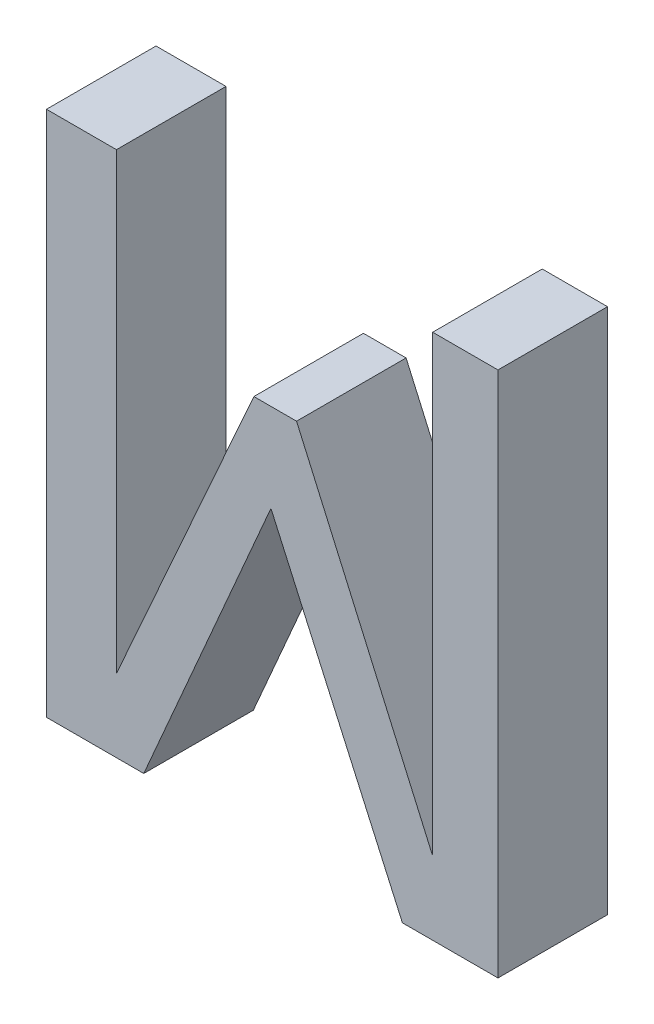
ISO-10303-21;
HEADER;
FILE_DESCRIPTION(('STEP AP214'),'2;1');
FILE_NAME('part.step','',(''),(''),'','','');
FILE_SCHEMA(('AUTOMOTIVE_DESIGN { 1 0 10303 214 1 1 1 1 }'));
ENDSEC;
DATA;
#1=APPLICATION_CONTEXT('core data for automotive mechanical design processes');
#2=APPLICATION_PROTOCOL_DEFINITION('international standard','automotive_design',2000,#1);
#3=PRODUCT_CONTEXT('',#1,'mechanical');
#4=PRODUCT('Part','Part','',(#3));
#5=PRODUCT_RELATED_PRODUCT_CATEGORY('part','',(#4));
#6=PRODUCT_DEFINITION_FORMATION('','',#4);
#7=PRODUCT_DEFINITION_CONTEXT('part definition',#1,'design');
#8=PRODUCT_DEFINITION('design','',#6,#7);
#9=PRODUCT_DEFINITION_SHAPE('','',#8);
#10=(LENGTH_UNIT() NAMED_UNIT(*) SI_UNIT(.MILLI.,.METRE.));
#11=(NAMED_UNIT(*) PLANE_ANGLE_UNIT() SI_UNIT($,.RADIAN.));
#12=(NAMED_UNIT(*) SI_UNIT($,.STERADIAN.) SOLID_ANGLE_UNIT());
#13=UNCERTAINTY_MEASURE_WITH_UNIT(LENGTH_MEASURE(1.E-05),#10,'distance_accuracy_value','');
#14=(GEOMETRIC_REPRESENTATION_CONTEXT(3) GLOBAL_UNCERTAINTY_ASSIGNED_CONTEXT((#13)) GLOBAL_UNIT_ASSIGNED_CONTEXT((#10,
#11,#12)) REPRESENTATION_CONTEXT('',''));
#15=CARTESIAN_POINT('',(0.,0.,0.));
#16=DIRECTION('',(0.,0.,1.));
#17=DIRECTION('',(1.,0.,0.));
#18=AXIS2_PLACEMENT_3D('',#15,#16,#17);
#19=CARTESIAN_POINT('',(-6.378337835046,-7.921012287779,0.));
#20=DIRECTION('',(1.,0.,0.));
#21=DIRECTION('',(0.,1.,0.));
#22=AXIS2_PLACEMENT_3D('',#19,#20,#21);
#23=PLANE('',#22);
#24=DIRECTION('',(0.,-1.,0.));
#25=VECTOR('',#24,1.);
#26=CARTESIAN_POINT('',(-6.378337835046,-7.506899475119,0.));
#27=LINE('',#26,#25);
#28=CARTESIAN_POINT('',(-6.378337835046,-7.506899475119,0.));
#29=VERTEX_POINT('',#28);
#30=CARTESIAN_POINT('',(-6.378337835046,-7.921012287779,0.));
#31=VERTEX_POINT('',#30);
#32=EDGE_CURVE('E11',#29,#31,#27,.T.);
#33=ORIENTED_EDGE('',*,*,#32,.F.);
#34=DIRECTION('',(0.,0.,1.));
#35=VECTOR('',#34,1.);
#36=CARTESIAN_POINT('',(-6.378337835046,-7.506899475119,0.));
#37=LINE('',#36,#35);
#38=CARTESIAN_POINT('',(-6.378337835046,-7.506899475119,0.1));
#39=VERTEX_POINT('',#38);
#40=EDGE_CURVE('E24',#29,#39,#37,.T.);
#41=ORIENTED_EDGE('',*,*,#40,.T.);
#42=DIRECTION('',(0.,1.,0.));
#43=VECTOR('',#42,1.);
#44=CARTESIAN_POINT('',(-6.378337835046,-7.506899475119,0.1));
#45=LINE('',#44,#43);
#46=CARTESIAN_POINT('',(-6.378337835046,-7.921012287779,0.1));
#47=VERTEX_POINT('',#46);
#48=EDGE_CURVE('E130',#47,#39,#45,.T.);
#49=ORIENTED_EDGE('',*,*,#48,.F.);
#50=DIRECTION('',(0.,0.,1.));
#51=VECTOR('',#50,1.);
#52=CARTESIAN_POINT('',(-6.378337835046,-7.921012287779,0.));
#53=LINE('',#52,#51);
#54=EDGE_CURVE('E211',#31,#47,#53,.T.);
#55=ORIENTED_EDGE('',*,*,#54,.F.);
#56=EDGE_LOOP('',(#33,#41,#49,#55));
#57=FACE_BOUND('',#56,.T.);
#58=ADVANCED_FACE('F17',(#57),#23,.T.);
#59=CARTESIAN_POINT('',(-6.252896324532,-7.639353243985,0.));
#60=DIRECTION('',(-0.913498663408962,0.406841728378542,0.));
#61=DIRECTION('',(-0.406841728378542,-0.913498663408962,0.));
#62=AXIS2_PLACEMENT_3D('',#59,#60,#61);
#63=PLANE('',#62);
#64=DIRECTION('',(0.406841728378542,0.913498663408962,0.));
#65=VECTOR('',#64,1.);
#66=CARTESIAN_POINT('',(-6.378337835046,-7.921012287779,0.));
#67=LINE('',#66,#65);
#68=CARTESIAN_POINT('',(-6.252896324532,-7.639353243985,0.));
#69=VERTEX_POINT('',#68);
#70=EDGE_CURVE('E209',#31,#69,#67,.T.);
#71=ORIENTED_EDGE('',*,*,#70,.F.);
#72=ORIENTED_EDGE('',*,*,#54,.T.);
#73=DIRECTION('',(-0.406841728378542,-0.913498663408962,0.));
#74=VECTOR('',#73,1.);
#75=CARTESIAN_POINT('',(-6.378337835046,-7.921012287779,0.1));
#76=LINE('',#75,#74);
#77=CARTESIAN_POINT('',(-6.252896324532,-7.639353243985,0.1));
#78=VERTEX_POINT('',#77);
#79=EDGE_CURVE('E207',#78,#47,#76,.T.);
#80=ORIENTED_EDGE('',*,*,#79,.F.);
#81=DIRECTION('',(0.,0.,1.));
#82=VECTOR('',#81,1.);
#83=CARTESIAN_POINT('',(-6.252896324532,-7.639353243985,0.));
#84=LINE('',#83,#82);
#85=EDGE_CURVE('E204',#69,#78,#84,.T.);
#86=ORIENTED_EDGE('',*,*,#85,.F.);
#87=EDGE_LOOP('',(#71,#72,#80,#86));
#88=FACE_BOUND('',#87,.T.);
#89=ADVANCED_FACE('F253',(#88),#63,.T.);
#90=CARTESIAN_POINT('',(-6.213939333689,-7.639353243985,0.));
#91=DIRECTION('',(0.,1.,0.));
#92=DIRECTION('',(-1.,0.,0.));
#93=AXIS2_PLACEMENT_3D('',#90,#91,#92);
#94=PLANE('',#93);
#95=DIRECTION('',(1.,0.,0.));
#96=VECTOR('',#95,1.);
#97=CARTESIAN_POINT('',(-6.252896324532,-7.639353243985,0.));
#98=LINE('',#97,#96);
#99=CARTESIAN_POINT('',(-6.213939333689,-7.639353243985,0.));
#100=VERTEX_POINT('',#99);
#101=EDGE_CURVE('E202',#69,#100,#98,.T.);
#102=ORIENTED_EDGE('',*,*,#101,.F.);
#103=ORIENTED_EDGE('',*,*,#85,.T.);
#104=DIRECTION('',(-1.,0.,0.));
#105=VECTOR('',#104,1.);
#106=CARTESIAN_POINT('',(-6.252896324532,-7.639353243985,0.1));
#107=LINE('',#106,#105);
#108=CARTESIAN_POINT('',(-6.213939333689,-7.639353243985,0.1));
#109=VERTEX_POINT('',#108);
#110=EDGE_CURVE('E199',#109,#78,#107,.T.);
#111=ORIENTED_EDGE('',*,*,#110,.F.);
#112=DIRECTION('',(0.,0.,1.));
#113=VECTOR('',#112,1.);
#114=CARTESIAN_POINT('',(-6.213939333689,-7.639353243985,0.));
#115=LINE('',#114,#113);
#116=EDGE_CURVE('E196',#100,#109,#115,.T.);
#117=ORIENTED_EDGE('',*,*,#116,.F.);
#118=EDGE_LOOP('',(#102,#103,#111,#117));
#119=FACE_BOUND('',#118,.T.);
#120=ADVANCED_FACE('F249',(#119),#94,.T.);
#121=CARTESIAN_POINT('',(-6.0896665329,-7.921012287779,0.));
#122=DIRECTION('',(0.914904056356068,0.403671360964848,0.));
#123=DIRECTION('',(-0.403671360964848,0.914904056356068,0.));
#124=AXIS2_PLACEMENT_3D('',#121,#122,#123);
#125=PLANE('',#124);
#126=DIRECTION('',(0.403671360964848,-0.914904056356068,0.));
#127=VECTOR('',#126,1.);
#128=CARTESIAN_POINT('',(-6.213939333689,-7.639353243985,0.));
#129=LINE('',#128,#127);
#130=CARTESIAN_POINT('',(-6.0896665329,-7.921012287779,0.));
#131=VERTEX_POINT('',#130);
#132=EDGE_CURVE('E194',#100,#131,#129,.T.);
#133=ORIENTED_EDGE('',*,*,#132,.F.);
#134=ORIENTED_EDGE('',*,*,#116,.T.);
#135=DIRECTION('',(-0.403671360964848,0.914904056356068,0.));
#136=VECTOR('',#135,1.);
#137=CARTESIAN_POINT('',(-6.213939333689,-7.639353243985,0.1));
#138=LINE('',#137,#136);
#139=CARTESIAN_POINT('',(-6.0896665329,-7.921012287779,0.1));
#140=VERTEX_POINT('',#139);
#141=EDGE_CURVE('E191',#140,#109,#138,.T.);
#142=ORIENTED_EDGE('',*,*,#141,.F.);
#143=DIRECTION('',(0.,0.,1.));
#144=VECTOR('',#143,1.);
#145=CARTESIAN_POINT('',(-6.0896665329,-7.921012287779,0.));
#146=LINE('',#145,#144);
#147=EDGE_CURVE('E188',#131,#140,#146,.T.);
#148=ORIENTED_EDGE('',*,*,#147,.F.);
#149=EDGE_LOOP('',(#133,#134,#142,#148));
#150=FACE_BOUND('',#149,.T.);
#151=ADVANCED_FACE('F245',(#150),#125,.T.);
#152=CARTESIAN_POINT('',(-6.0896665329,-7.506899475119,0.));
#153=DIRECTION('',(-1.,0.,0.));
#154=DIRECTION('',(0.,-1.,0.));
#155=AXIS2_PLACEMENT_3D('',#152,#153,#154);
#156=PLANE('',#155);
#157=DIRECTION('',(0.,1.,0.));
#158=VECTOR('',#157,1.);
#159=CARTESIAN_POINT('',(-6.0896665329,-7.921012287779,0.));
#160=LINE('',#159,#158);
#161=CARTESIAN_POINT('',(-6.0896665329,-7.506899475119,0.));
#162=VERTEX_POINT('',#161);
#163=EDGE_CURVE('E186',#131,#162,#160,.T.);
#164=ORIENTED_EDGE('',*,*,#163,.F.);
#165=ORIENTED_EDGE('',*,*,#147,.T.);
#166=DIRECTION('',(0.,-1.,0.));
#167=VECTOR('',#166,1.);
#168=CARTESIAN_POINT('',(-6.0896665329,-7.921012287779,0.1));
#169=LINE('',#168,#167);
#170=CARTESIAN_POINT('',(-6.0896665329,-7.506899475119,0.1));
#171=VERTEX_POINT('',#170);
#172=EDGE_CURVE('E183',#171,#140,#169,.T.);
#173=ORIENTED_EDGE('',*,*,#172,.F.);
#174=DIRECTION('',(0.,0.,1.));
#175=VECTOR('',#174,1.);
#176=CARTESIAN_POINT('',(-6.0896665329,-7.506899475119,0.));
#177=LINE('',#176,#175);
#178=EDGE_CURVE('E180',#162,#171,#177,.T.);
#179=ORIENTED_EDGE('',*,*,#178,.F.);
#180=EDGE_LOOP('',(#164,#165,#173,#179));
#181=FACE_BOUND('',#180,.T.);
#182=ADVANCED_FACE('F241',(#181),#156,.T.);
#183=CARTESIAN_POINT('',(-6.030062336911,-7.506899475119,0.));
#184=DIRECTION('',(0.,1.,0.));
#185=DIRECTION('',(-1.,0.,0.));
#186=AXIS2_PLACEMENT_3D('',#183,#184,#185);
#187=PLANE('',#186);
#188=DIRECTION('',(1.,0.,0.));
#189=VECTOR('',#188,1.);
#190=CARTESIAN_POINT('',(-6.0896665329,-7.506899475119,0.));
#191=LINE('',#190,#189);
#192=CARTESIAN_POINT('',(-6.030062336911,-7.506899475119,0.));
#193=VERTEX_POINT('',#192);
#194=EDGE_CURVE('E178',#162,#193,#191,.T.);
#195=ORIENTED_EDGE('',*,*,#194,.F.);
#196=ORIENTED_EDGE('',*,*,#178,.T.);
#197=DIRECTION('',(-1.,0.,0.));
#198=VECTOR('',#197,1.);
#199=CARTESIAN_POINT('',(-6.0896665329,-7.506899475119,0.1));
#200=LINE('',#199,#198);
#201=CARTESIAN_POINT('',(-6.030062336911,-7.506899475119,0.1));
#202=VERTEX_POINT('',#201);
#203=EDGE_CURVE('E175',#202,#171,#200,.T.);
#204=ORIENTED_EDGE('',*,*,#203,.F.);
#205=DIRECTION('',(0.,0.,1.));
#206=VECTOR('',#205,1.);
#207=CARTESIAN_POINT('',(-6.030062336911,-7.506899475119,0.));
#208=LINE('',#207,#206);
#209=EDGE_CURVE('E172',#193,#202,#208,.T.);
#210=ORIENTED_EDGE('',*,*,#209,.F.);
#211=EDGE_LOOP('',(#195,#196,#204,#210));
#212=FACE_BOUND('',#211,.T.);
#213=ADVANCED_FACE('F237',(#212),#187,.T.);
#214=CARTESIAN_POINT('',(-6.030062336911,-7.98762874212,0.));
#215=DIRECTION('',(1.,0.,0.));
#216=DIRECTION('',(0.,1.,0.));
#217=AXIS2_PLACEMENT_3D('',#214,#215,#216);
#218=PLANE('',#217);
#219=DIRECTION('',(0.,-1.,0.));
#220=VECTOR('',#219,1.);
#221=CARTESIAN_POINT('',(-6.030062336911,-7.506899475119,0.));
#222=LINE('',#221,#220);
#223=CARTESIAN_POINT('',(-6.030062336911,-7.98762874212,0.));
#224=VERTEX_POINT('',#223);
#225=EDGE_CURVE('E170',#193,#224,#222,.T.);
#226=ORIENTED_EDGE('',*,*,#225,.F.);
#227=ORIENTED_EDGE('',*,*,#209,.T.);
#228=DIRECTION('',(0.,1.,0.));
#229=VECTOR('',#228,1.);
#230=CARTESIAN_POINT('',(-6.030062336911,-7.506899475119,0.1));
#231=LINE('',#230,#229);
#232=CARTESIAN_POINT('',(-6.030062336911,-7.98762874212,0.1));
#233=VERTEX_POINT('',#232);
#234=EDGE_CURVE('E167',#233,#202,#231,.T.);
#235=ORIENTED_EDGE('',*,*,#234,.F.);
#236=DIRECTION('',(0.,0.,1.));
#237=VECTOR('',#236,1.);
#238=CARTESIAN_POINT('',(-6.030062336911,-7.98762874212,0.));
#239=LINE('',#238,#237);
#240=EDGE_CURVE('E164',#224,#233,#239,.T.);
#241=ORIENTED_EDGE('',*,*,#240,.F.);
#242=EDGE_LOOP('',(#226,#227,#235,#241));
#243=FACE_BOUND('',#242,.T.);
#244=ADVANCED_FACE('F233',(#243),#218,.T.);
#245=CARTESIAN_POINT('',(-6.117325996399,-7.98762874212,0.));
#246=DIRECTION('',(0.,-1.,0.));
#247=DIRECTION('',(1.,0.,0.));
#248=AXIS2_PLACEMENT_3D('',#245,#246,#247);
#249=PLANE('',#248);
#250=DIRECTION('',(-1.,0.,0.));
#251=VECTOR('',#250,1.);
#252=CARTESIAN_POINT('',(-6.030062336911,-7.98762874212,0.));
#253=LINE('',#252,#251);
#254=CARTESIAN_POINT('',(-6.117325996399,-7.98762874212,0.));
#255=VERTEX_POINT('',#254);
#256=EDGE_CURVE('E162',#224,#255,#253,.T.);
#257=ORIENTED_EDGE('',*,*,#256,.F.);
#258=ORIENTED_EDGE('',*,*,#240,.T.);
#259=DIRECTION('',(1.,0.,0.));
#260=VECTOR('',#259,1.);
#261=CARTESIAN_POINT('',(-6.030062336911,-7.98762874212,0.1));
#262=LINE('',#261,#260);
#263=CARTESIAN_POINT('',(-6.117325996399,-7.98762874212,0.1));
#264=VERTEX_POINT('',#263);
#265=EDGE_CURVE('E159',#264,#233,#262,.T.);
#266=ORIENTED_EDGE('',*,*,#265,.F.);
#267=DIRECTION('',(0.,0.,1.));
#268=VECTOR('',#267,1.);
#269=CARTESIAN_POINT('',(-6.117325996399,-7.98762874212,0.));
#270=LINE('',#269,#268);
#271=EDGE_CURVE('E156',#255,#264,#270,.T.);
#272=ORIENTED_EDGE('',*,*,#271,.F.);
#273=EDGE_LOOP('',(#257,#258,#266,#272));
#274=FACE_BOUND('',#273,.T.);
#275=ADVANCED_FACE('F229',(#274),#249,.T.);
#276=CARTESIAN_POINT('',(-6.237313528195,-7.71999421503,0.));
#277=DIRECTION('',(-0.912492227721691,-0.409094040958195,0.));
#278=DIRECTION('',(0.409094040958195,-0.912492227721691,0.));
#279=AXIS2_PLACEMENT_3D('',#276,#277,#278);
#280=PLANE('',#279);
#281=DIRECTION('',(-0.409094040958195,0.912492227721691,0.));
#282=VECTOR('',#281,1.);
#283=CARTESIAN_POINT('',(-6.117325996399,-7.98762874212,0.));
#284=LINE('',#283,#282);
#285=CARTESIAN_POINT('',(-6.237313528195,-7.71999421503,0.));
#286=VERTEX_POINT('',#285);
#287=EDGE_CURVE('E154',#255,#286,#284,.T.);
#288=ORIENTED_EDGE('',*,*,#287,.F.);
#289=ORIENTED_EDGE('',*,*,#271,.T.);
#290=DIRECTION('',(0.409094040958195,-0.912492227721691,0.));
#291=VECTOR('',#290,1.);
#292=CARTESIAN_POINT('',(-6.117325996399,-7.98762874212,0.1));
#293=LINE('',#292,#291);
#294=CARTESIAN_POINT('',(-6.237313528195,-7.71999421503,0.1));
#295=VERTEX_POINT('',#294);
#296=EDGE_CURVE('E151',#295,#264,#293,.T.);
#297=ORIENTED_EDGE('',*,*,#296,.F.);
#298=DIRECTION('',(0.,0.,1.));
#299=VECTOR('',#298,1.);
#300=CARTESIAN_POINT('',(-6.237313528195,-7.71999421503,0.));
#301=LINE('',#300,#299);
#302=EDGE_CURVE('E148',#286,#295,#301,.T.);
#303=ORIENTED_EDGE('',*,*,#302,.F.);
#304=EDGE_LOOP('',(#288,#289,#297,#303));
#305=FACE_BOUND('',#304,.T.);
#306=ADVANCED_FACE('F225',(#305),#280,.T.);
#307=CARTESIAN_POINT('',(-6.353405360906,-7.98762874212,0.));
#308=DIRECTION('',(0.917409408006231,-0.397944692264712,0.));
#309=DIRECTION('',(0.397944692264712,0.917409408006231,0.));
#310=AXIS2_PLACEMENT_3D('',#307,#308,#309);
#311=PLANE('',#310);
#312=DIRECTION('',(-0.397944692264712,-0.917409408006231,0.));
#313=VECTOR('',#312,1.);
#314=CARTESIAN_POINT('',(-6.237313528195,-7.71999421503,0.));
#315=LINE('',#314,#313);
#316=CARTESIAN_POINT('',(-6.353405360906,-7.98762874212,0.));
#317=VERTEX_POINT('',#316);
#318=EDGE_CURVE('E146',#286,#317,#315,.T.);
#319=ORIENTED_EDGE('',*,*,#318,.F.);
#320=ORIENTED_EDGE('',*,*,#302,.T.);
#321=DIRECTION('',(0.397944692264712,0.917409408006231,0.));
#322=VECTOR('',#321,1.);
#323=CARTESIAN_POINT('',(-6.237313528195,-7.71999421503,0.1));
#324=LINE('',#323,#322);
#325=CARTESIAN_POINT('',(-6.353405360906,-7.98762874212,0.1));
#326=VERTEX_POINT('',#325);
#327=EDGE_CURVE('E143',#326,#295,#324,.T.);
#328=ORIENTED_EDGE('',*,*,#327,.F.);
#329=DIRECTION('',(0.,0.,1.));
#330=VECTOR('',#329,1.);
#331=CARTESIAN_POINT('',(-6.353405360906,-7.98762874212,0.));
#332=LINE('',#331,#330);
#333=EDGE_CURVE('E140',#317,#326,#332,.T.);
#334=ORIENTED_EDGE('',*,*,#333,.F.);
#335=EDGE_LOOP('',(#319,#320,#328,#334));
#336=FACE_BOUND('',#335,.T.);
#337=ADVANCED_FACE('F221',(#336),#311,.T.);
#338=CARTESIAN_POINT('',(-6.442227300028,-7.98762874212,0.));
#339=DIRECTION('',(0.,-1.,0.));
#340=DIRECTION('',(1.,0.,0.));
#341=AXIS2_PLACEMENT_3D('',#338,#339,#340);
#342=PLANE('',#341);
#343=DIRECTION('',(-1.,0.,0.));
#344=VECTOR('',#343,1.);
#345=CARTESIAN_POINT('',(-6.353405360906,-7.98762874212,0.));
#346=LINE('',#345,#344);
#347=CARTESIAN_POINT('',(-6.442227300028,-7.98762874212,0.));
#348=VERTEX_POINT('',#347);
#349=EDGE_CURVE('E138',#317,#348,#346,.T.);
#350=ORIENTED_EDGE('',*,*,#349,.F.);
#351=ORIENTED_EDGE('',*,*,#333,.T.);
#352=DIRECTION('',(1.,0.,0.));
#353=VECTOR('',#352,1.);
#354=CARTESIAN_POINT('',(-6.353405360906,-7.98762874212,0.1));
#355=LINE('',#354,#353);
#356=CARTESIAN_POINT('',(-6.442227300028,-7.98762874212,0.1));
#357=VERTEX_POINT('',#356);
#358=EDGE_CURVE('E136',#357,#326,#355,.T.);
#359=ORIENTED_EDGE('',*,*,#358,.F.);
#360=DIRECTION('',(0.,0.,1.));
#361=VECTOR('',#360,1.);
#362=CARTESIAN_POINT('',(-6.442227300028,-7.98762874212,0.));
#363=LINE('',#362,#361);
#364=EDGE_CURVE('E115',#348,#357,#363,.T.);
#365=ORIENTED_EDGE('',*,*,#364,.F.);
#366=EDGE_LOOP('',(#350,#351,#359,#365));
#367=FACE_BOUND('',#366,.T.);
#368=ADVANCED_FACE('F219',(#367),#342,.T.);
#369=CARTESIAN_POINT('',(-6.442227300028,-7.506899475119,0.));
#370=DIRECTION('',(-1.,0.,0.));
#371=DIRECTION('',(0.,-1.,0.));
#372=AXIS2_PLACEMENT_3D('',#369,#370,#371);
#373=PLANE('',#372);
#374=DIRECTION('',(0.,1.,0.));
#375=VECTOR('',#374,1.);
#376=CARTESIAN_POINT('',(-6.442227300028,-7.98762874212,0.));
#377=LINE('',#376,#375);
#378=CARTESIAN_POINT('',(-6.442227300028,-7.506899475119,0.));
#379=VERTEX_POINT('',#378);
#380=EDGE_CURVE('E119',#348,#379,#377,.T.);
#381=ORIENTED_EDGE('',*,*,#380,.F.);
#382=ORIENTED_EDGE('',*,*,#364,.T.);
#383=DIRECTION('',(0.,-1.,0.));
#384=VECTOR('',#383,1.);
#385=CARTESIAN_POINT('',(-6.442227300028,-7.98762874212,0.1));
#386=LINE('',#385,#384);
#387=CARTESIAN_POINT('',(-6.442227300028,-7.506899475119,0.1));
#388=VERTEX_POINT('',#387);
#389=EDGE_CURVE('E108',#388,#357,#386,.T.);
#390=ORIENTED_EDGE('',*,*,#389,.F.);
#391=DIRECTION('',(0.,0.,1.));
#392=VECTOR('',#391,1.);
#393=CARTESIAN_POINT('',(-6.442227300028,-7.506899475119,0.));
#394=LINE('',#393,#392);
#395=EDGE_CURVE('E112',#379,#388,#394,.T.);
#396=ORIENTED_EDGE('',*,*,#395,.F.);
#397=EDGE_LOOP('',(#381,#382,#390,#396));
#398=FACE_BOUND('',#397,.T.);
#399=ADVANCED_FACE('F111',(#398),#373,.T.);
#400=CARTESIAN_POINT('',(-6.378337835046,-7.506899475119,0.));
#401=DIRECTION('',(0.,1.,0.));
#402=DIRECTION('',(-1.,0.,0.));
#403=AXIS2_PLACEMENT_3D('',#400,#401,#402);
#404=PLANE('',#403);
#405=DIRECTION('',(1.,0.,0.));
#406=VECTOR('',#405,1.);
#407=CARTESIAN_POINT('',(-6.442227300028,-7.506899475119,0.));
#408=LINE('',#407,#406);
#409=EDGE_CURVE('E125',#379,#29,#408,.T.);
#410=ORIENTED_EDGE('',*,*,#409,.F.);
#411=ORIENTED_EDGE('',*,*,#395,.T.);
#412=DIRECTION('',(-1.,0.,0.));
#413=VECTOR('',#412,1.);
#414=CARTESIAN_POINT('',(-6.442227300028,-7.506899475119,0.1));
#415=LINE('',#414,#413);
#416=EDGE_CURVE('E124',#39,#388,#415,.T.);
#417=ORIENTED_EDGE('',*,*,#416,.F.);
#418=ORIENTED_EDGE('',*,*,#40,.F.);
#419=EDGE_LOOP('',(#410,#411,#417,#418));
#420=FACE_BOUND('',#419,.T.);
#421=ADVANCED_FACE('F123',(#420),#404,.T.);
#422=CARTESIAN_POINT('',(-6.235388325248,-7.766326790848,0.));
#423=DIRECTION('',(0.,0.,1.));
#424=DIRECTION('',(1.,0.,0.));
#425=AXIS2_PLACEMENT_3D('',#422,#423,#424);
#426=PLANE('',#425);
#427=ORIENTED_EDGE('',*,*,#409,.T.);
#428=ORIENTED_EDGE('',*,*,#32,.T.);
#429=ORIENTED_EDGE('',*,*,#70,.T.);
#430=ORIENTED_EDGE('',*,*,#101,.T.);
#431=ORIENTED_EDGE('',*,*,#132,.T.);
#432=ORIENTED_EDGE('',*,*,#163,.T.);
#433=ORIENTED_EDGE('',*,*,#194,.T.);
#434=ORIENTED_EDGE('',*,*,#225,.T.);
#435=ORIENTED_EDGE('',*,*,#256,.T.);
#436=ORIENTED_EDGE('',*,*,#287,.T.);
#437=ORIENTED_EDGE('',*,*,#318,.T.);
#438=ORIENTED_EDGE('',*,*,#349,.T.);
#439=ORIENTED_EDGE('',*,*,#380,.T.);
#440=EDGE_LOOP('',(#427,#428,#429,#430,#431,#432,#433,#434,#435,#436,#437,#438,#439));
#441=FACE_BOUND('',#440,.T.);
#442=ADVANCED_FACE('F214',(#441),#426,.F.);
#443=CARTESIAN_POINT('',(-6.235388325248,-7.766326790848,0.1));
#444=DIRECTION('',(0.,0.,1.));
#445=DIRECTION('',(1.,0.,0.));
#446=AXIS2_PLACEMENT_3D('',#443,#444,#445);
#447=PLANE('',#446);
#448=ORIENTED_EDGE('',*,*,#416,.T.);
#449=ORIENTED_EDGE('',*,*,#389,.T.);
#450=ORIENTED_EDGE('',*,*,#358,.T.);
#451=ORIENTED_EDGE('',*,*,#327,.T.);
#452=ORIENTED_EDGE('',*,*,#296,.T.);
#453=ORIENTED_EDGE('',*,*,#265,.T.);
#454=ORIENTED_EDGE('',*,*,#234,.T.);
#455=ORIENTED_EDGE('',*,*,#203,.T.);
#456=ORIENTED_EDGE('',*,*,#172,.T.);
#457=ORIENTED_EDGE('',*,*,#141,.T.);
#458=ORIENTED_EDGE('',*,*,#110,.T.);
#459=ORIENTED_EDGE('',*,*,#79,.T.);
#460=ORIENTED_EDGE('',*,*,#48,.T.);
#461=EDGE_LOOP('',(#448,#449,#450,#451,#452,#453,#454,#455,#456,#457,#458,#459,#460));
#462=FACE_BOUND('',#461,.T.);
#463=ADVANCED_FACE('F128',(#462),#447,.T.);
#464=CLOSED_SHELL('',(#58,#89,#120,#151,#182,#213,#244,#275,#306,#337,#368,#399,#421,#442,#463));
#465=MANIFOLD_SOLID_BREP('B1',#464);
#466=ADVANCED_BREP_SHAPE_REPRESENTATION('',(#18,#465),#14);
#467=SHAPE_DEFINITION_REPRESENTATION(#9,#466);
ENDSEC;
END-ISO-10303-21;
